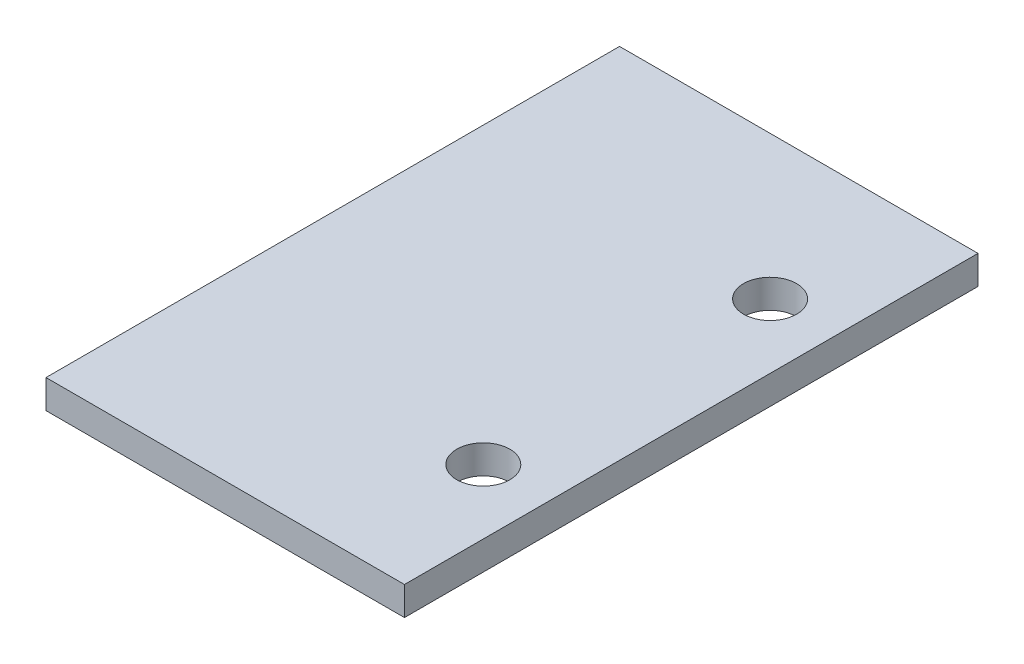
ISO-10303-21;
HEADER;
FILE_DESCRIPTION(('STEP AP214'),'2;1');
FILE_NAME('part.step','',(''),(''),'','','');
FILE_SCHEMA(('AUTOMOTIVE_DESIGN { 1 0 10303 214 1 1 1 1 }'));
ENDSEC;
DATA;
#1=APPLICATION_CONTEXT('core data for automotive mechanical design processes');
#2=APPLICATION_PROTOCOL_DEFINITION('international standard','automotive_design',2000,#1);
#3=PRODUCT_CONTEXT('',#1,'mechanical');
#4=PRODUCT('Part','Part','',(#3));
#5=PRODUCT_RELATED_PRODUCT_CATEGORY('part','',(#4));
#6=PRODUCT_DEFINITION_FORMATION('','',#4);
#7=PRODUCT_DEFINITION_CONTEXT('part definition',#1,'design');
#8=PRODUCT_DEFINITION('design','',#6,#7);
#9=PRODUCT_DEFINITION_SHAPE('','',#8);
#10=(LENGTH_UNIT() NAMED_UNIT(*) SI_UNIT(.MILLI.,.METRE.));
#11=(NAMED_UNIT(*) PLANE_ANGLE_UNIT() SI_UNIT($,.RADIAN.));
#12=(NAMED_UNIT(*) SI_UNIT($,.STERADIAN.) SOLID_ANGLE_UNIT());
#13=UNCERTAINTY_MEASURE_WITH_UNIT(LENGTH_MEASURE(1.E-05),#10,'distance_accuracy_value','');
#14=(GEOMETRIC_REPRESENTATION_CONTEXT(3) GLOBAL_UNCERTAINTY_ASSIGNED_CONTEXT((#13)) GLOBAL_UNIT_ASSIGNED_CONTEXT((#10,
#11,#12)) REPRESENTATION_CONTEXT('',''));
#15=CARTESIAN_POINT('',(0.,0.,0.));
#16=DIRECTION('',(0.,0.,1.));
#17=DIRECTION('',(1.,0.,0.));
#18=AXIS2_PLACEMENT_3D('',#15,#16,#17);
#19=CARTESIAN_POINT('',(0.,2.,0.));
#20=DIRECTION('',(0.,-1.,0.));
#21=DIRECTION('',(0.,0.,-1.));
#22=AXIS2_PLACEMENT_3D('',#19,#20,#21);
#23=PLANE('',#22);
#24=DIRECTION('',(0.,0.,1.));
#25=VECTOR('',#24,1.);
#26=CARTESIAN_POINT('',(0.,2.,0.));
#27=LINE('',#26,#25);
#28=CARTESIAN_POINT('',(0.,2.,-40.));
#29=VERTEX_POINT('',#28);
#30=CARTESIAN_POINT('',(0.,2.,0.));
#31=VERTEX_POINT('',#30);
#32=EDGE_CURVE('E84',#29,#31,#27,.T.);
#33=ORIENTED_EDGE('',*,*,#32,.T.);
#34=DIRECTION('',(1.,0.,0.));
#35=VECTOR('',#34,1.);
#36=CARTESIAN_POINT('',(0.,2.,0.));
#37=LINE('',#36,#35);
#38=CARTESIAN_POINT('',(25.,2.,0.));
#39=VERTEX_POINT('',#38);
#40=EDGE_CURVE('E79',#31,#39,#37,.T.);
#41=ORIENTED_EDGE('',*,*,#40,.T.);
#42=DIRECTION('',(0.,0.,-1.));
#43=VECTOR('',#42,1.);
#44=CARTESIAN_POINT('',(25.,2.,0.));
#45=LINE('',#44,#43);
#46=CARTESIAN_POINT('',(25.,2.,-40.));
#47=VERTEX_POINT('',#46);
#48=EDGE_CURVE('E82',#39,#47,#45,.T.);
#49=ORIENTED_EDGE('',*,*,#48,.T.);
#50=DIRECTION('',(-1.,0.,0.));
#51=VECTOR('',#50,1.);
#52=CARTESIAN_POINT('',(0.,2.,-40.));
#53=LINE('',#52,#51);
#54=EDGE_CURVE('E49',#47,#29,#53,.T.);
#55=ORIENTED_EDGE('',*,*,#54,.T.);
#56=EDGE_LOOP('',(#33,#41,#49,#55));
#57=FACE_BOUND('',#56,.T.);
#58=CARTESIAN_POINT('',(20.5,2.,-30.));
#59=DIRECTION('',(0.,1.,0.));
#60=DIRECTION('',(0.,0.,1.));
#61=AXIS2_PLACEMENT_3D('',#58,#59,#60);
#62=CIRCLE('',#61,1.85);
#63=CARTESIAN_POINT('',(20.5,2.,-28.15));
#64=VERTEX_POINT('',#63);
#65=EDGE_CURVE('E99',#64,#64,#62,.T.);
#66=ORIENTED_EDGE('',*,*,#65,.F.);
#67=EDGE_LOOP('',(#66));
#68=FACE_BOUND('',#67,.T.);
#69=CARTESIAN_POINT('',(20.5,2.,-10.));
#70=DIRECTION('',(0.,1.,0.));
#71=DIRECTION('',(0.,0.,1.));
#72=AXIS2_PLACEMENT_3D('',#69,#70,#71);
#73=CIRCLE('',#72,1.85);
#74=CARTESIAN_POINT('',(20.5,2.,-8.15));
#75=VERTEX_POINT('',#74);
#76=EDGE_CURVE('E114',#75,#75,#73,.T.);
#77=ORIENTED_EDGE('',*,*,#76,.F.);
#78=EDGE_LOOP('',(#77));
#79=FACE_BOUND('',#78,.T.);
#80=ADVANCED_FACE('F32',(#57,#68,#79),#23,.F.);
#81=CARTESIAN_POINT('',(0.,0.,0.));
#82=DIRECTION('',(0.,-1.,0.));
#83=DIRECTION('',(0.,0.,-1.));
#84=AXIS2_PLACEMENT_3D('',#81,#82,#83);
#85=PLANE('',#84);
#86=CARTESIAN_POINT('',(20.5,0.,-30.));
#87=DIRECTION('',(0.,1.,0.));
#88=DIRECTION('',(0.,0.,1.));
#89=AXIS2_PLACEMENT_3D('',#86,#87,#88);
#90=CIRCLE('',#89,1.85);
#91=CARTESIAN_POINT('',(20.5,0.,-28.15));
#92=VERTEX_POINT('',#91);
#93=EDGE_CURVE('E111',#92,#92,#90,.T.);
#94=ORIENTED_EDGE('',*,*,#93,.T.);
#95=EDGE_LOOP('',(#94));
#96=FACE_BOUND('',#95,.T.);
#97=DIRECTION('',(0.,0.,1.));
#98=VECTOR('',#97,1.);
#99=CARTESIAN_POINT('',(0.,0.,0.));
#100=LINE('',#99,#98);
#101=CARTESIAN_POINT('',(0.,0.,-40.));
#102=VERTEX_POINT('',#101);
#103=CARTESIAN_POINT('',(0.,0.,0.));
#104=VERTEX_POINT('',#103);
#105=EDGE_CURVE('E96',#102,#104,#100,.T.);
#106=ORIENTED_EDGE('',*,*,#105,.F.);
#107=DIRECTION('',(-1.,0.,0.));
#108=VECTOR('',#107,1.);
#109=CARTESIAN_POINT('',(0.,0.,-40.));
#110=LINE('',#109,#108);
#111=CARTESIAN_POINT('',(25.,0.,-40.));
#112=VERTEX_POINT('',#111);
#113=EDGE_CURVE('E72',#112,#102,#110,.T.);
#114=ORIENTED_EDGE('',*,*,#113,.F.);
#115=DIRECTION('',(0.,0.,-1.));
#116=VECTOR('',#115,1.);
#117=CARTESIAN_POINT('',(25.,0.,0.));
#118=LINE('',#117,#116);
#119=CARTESIAN_POINT('',(25.,0.,0.));
#120=VERTEX_POINT('',#119);
#121=EDGE_CURVE('E66',#120,#112,#118,.T.);
#122=ORIENTED_EDGE('',*,*,#121,.F.);
#123=DIRECTION('',(1.,0.,0.));
#124=VECTOR('',#123,1.);
#125=CARTESIAN_POINT('',(0.,0.,0.));
#126=LINE('',#125,#124);
#127=EDGE_CURVE('E88',#104,#120,#126,.T.);
#128=ORIENTED_EDGE('',*,*,#127,.F.);
#129=EDGE_LOOP('',(#106,#114,#122,#128));
#130=FACE_BOUND('',#129,.T.);
#131=CARTESIAN_POINT('',(20.5,0.,-10.));
#132=DIRECTION('',(0.,1.,0.));
#133=DIRECTION('',(0.,0.,1.));
#134=AXIS2_PLACEMENT_3D('',#131,#132,#133);
#135=CIRCLE('',#134,1.85);
#136=CARTESIAN_POINT('',(20.5,0.,-8.15));
#137=VERTEX_POINT('',#136);
#138=EDGE_CURVE('E117',#137,#137,#135,.T.);
#139=ORIENTED_EDGE('',*,*,#138,.T.);
#140=EDGE_LOOP('',(#139));
#141=FACE_BOUND('',#140,.T.);
#142=ADVANCED_FACE('F107',(#96,#130,#141),#85,.T.);
#143=CARTESIAN_POINT('',(0.,2.,0.));
#144=DIRECTION('',(1.,0.,0.));
#145=DIRECTION('',(0.,0.,-1.));
#146=AXIS2_PLACEMENT_3D('',#143,#144,#145);
#147=PLANE('',#146);
#148=ORIENTED_EDGE('',*,*,#105,.T.);
#149=DIRECTION('',(0.,-1.,0.));
#150=VECTOR('',#149,1.);
#151=CARTESIAN_POINT('',(0.,2.,0.));
#152=LINE('',#151,#150);
#153=EDGE_CURVE('E11',#31,#104,#152,.T.);
#154=ORIENTED_EDGE('',*,*,#153,.F.);
#155=ORIENTED_EDGE('',*,*,#32,.F.);
#156=DIRECTION('',(0.,-1.,0.));
#157=VECTOR('',#156,1.);
#158=CARTESIAN_POINT('',(0.,2.,-40.));
#159=LINE('',#158,#157);
#160=EDGE_CURVE('E92',#29,#102,#159,.T.);
#161=ORIENTED_EDGE('',*,*,#160,.T.);
#162=EDGE_LOOP('',(#148,#154,#155,#161));
#163=FACE_BOUND('',#162,.T.);
#164=ADVANCED_FACE('F34',(#163),#147,.F.);
#165=CARTESIAN_POINT('',(0.,2.,0.));
#166=DIRECTION('',(0.,0.,-1.));
#167=DIRECTION('',(-1.,0.,0.));
#168=AXIS2_PLACEMENT_3D('',#165,#166,#167);
#169=PLANE('',#168);
#170=ORIENTED_EDGE('',*,*,#127,.T.);
#171=DIRECTION('',(0.,-1.,0.));
#172=VECTOR('',#171,1.);
#173=CARTESIAN_POINT('',(25.,2.,0.));
#174=LINE('',#173,#172);
#175=EDGE_CURVE('E41',#39,#120,#174,.T.);
#176=ORIENTED_EDGE('',*,*,#175,.F.);
#177=ORIENTED_EDGE('',*,*,#40,.F.);
#178=ORIENTED_EDGE('',*,*,#153,.T.);
#179=EDGE_LOOP('',(#170,#176,#177,#178));
#180=FACE_BOUND('',#179,.T.);
#181=ADVANCED_FACE('F87',(#180),#169,.F.);
#182=CARTESIAN_POINT('',(25.,2.,0.));
#183=DIRECTION('',(-1.,0.,0.));
#184=DIRECTION('',(0.,0.,1.));
#185=AXIS2_PLACEMENT_3D('',#182,#183,#184);
#186=PLANE('',#185);
#187=ORIENTED_EDGE('',*,*,#121,.T.);
#188=DIRECTION('',(0.,-1.,0.));
#189=VECTOR('',#188,1.);
#190=CARTESIAN_POINT('',(25.,2.,-40.));
#191=LINE('',#190,#189);
#192=EDGE_CURVE('E89',#47,#112,#191,.T.);
#193=ORIENTED_EDGE('',*,*,#192,.F.);
#194=ORIENTED_EDGE('',*,*,#48,.F.);
#195=ORIENTED_EDGE('',*,*,#175,.T.);
#196=EDGE_LOOP('',(#187,#193,#194,#195));
#197=FACE_BOUND('',#196,.T.);
#198=ADVANCED_FACE('F90',(#197),#186,.F.);
#199=CARTESIAN_POINT('',(0.,2.,-40.));
#200=DIRECTION('',(0.,0.,1.));
#201=DIRECTION('',(1.,0.,0.));
#202=AXIS2_PLACEMENT_3D('',#199,#200,#201);
#203=PLANE('',#202);
#204=ORIENTED_EDGE('',*,*,#113,.T.);
#205=ORIENTED_EDGE('',*,*,#160,.F.);
#206=ORIENTED_EDGE('',*,*,#54,.F.);
#207=ORIENTED_EDGE('',*,*,#192,.T.);
#208=EDGE_LOOP('',(#204,#205,#206,#207));
#209=FACE_BOUND('',#208,.T.);
#210=ADVANCED_FACE('F104',(#209),#203,.F.);
#211=CARTESIAN_POINT('',(20.5,2.,-30.));
#212=DIRECTION('',(0.,-1.,0.));
#213=DIRECTION('',(0.,0.,-1.));
#214=AXIS2_PLACEMENT_3D('',#211,#212,#213);
#215=CYLINDRICAL_SURFACE('',#214,1.85);
#216=ORIENTED_EDGE('',*,*,#65,.T.);
#217=EDGE_LOOP('',(#216));
#218=FACE_BOUND('',#217,.T.);
#219=ORIENTED_EDGE('',*,*,#93,.F.);
#220=EDGE_LOOP('',(#219));
#221=FACE_BOUND('',#220,.T.);
#222=ADVANCED_FACE('F134',(#218,#221),#215,.F.);
#223=CARTESIAN_POINT('',(20.5,2.,-10.));
#224=DIRECTION('',(0.,-1.,0.));
#225=DIRECTION('',(0.,0.,-1.));
#226=AXIS2_PLACEMENT_3D('',#223,#224,#225);
#227=CYLINDRICAL_SURFACE('',#226,1.85);
#228=ORIENTED_EDGE('',*,*,#76,.T.);
#229=EDGE_LOOP('',(#228));
#230=FACE_BOUND('',#229,.T.);
#231=ORIENTED_EDGE('',*,*,#138,.F.);
#232=EDGE_LOOP('',(#231));
#233=FACE_BOUND('',#232,.T.);
#234=ADVANCED_FACE('F123',(#230,#233),#227,.F.);
#235=CLOSED_SHELL('',(#80,#142,#164,#181,#198,#210,#222,#234));
#236=MANIFOLD_SOLID_BREP('B2',#235);
#237=ADVANCED_BREP_SHAPE_REPRESENTATION('',(#18,#236),#14);
#238=SHAPE_DEFINITION_REPRESENTATION(#9,#237);
ENDSEC;
END-ISO-10303-21;
